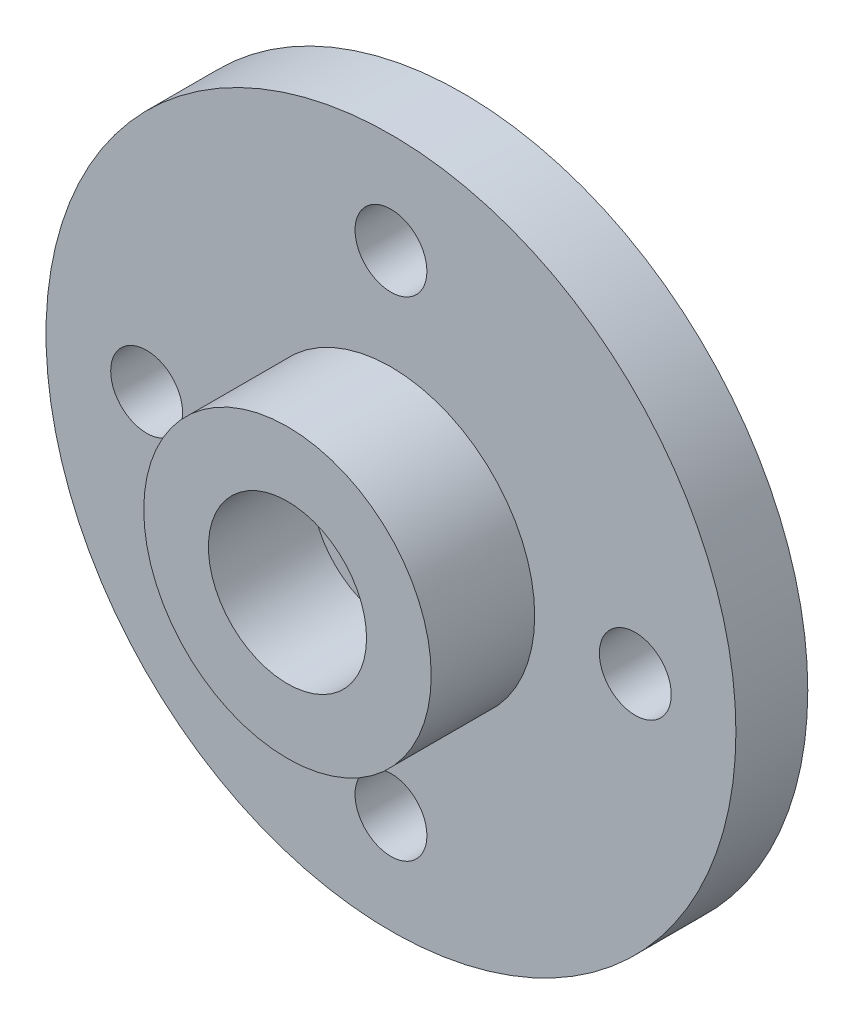
ISO-10303-21;
HEADER;
FILE_DESCRIPTION(('STEP AP214'),'2;1');
FILE_NAME('part.step','',(''),(''),'','','');
FILE_SCHEMA(('AUTOMOTIVE_DESIGN { 1 0 10303 214 1 1 1 1 }'));
ENDSEC;
DATA;
#1=APPLICATION_CONTEXT('core data for automotive mechanical design processes');
#2=APPLICATION_PROTOCOL_DEFINITION('international standard','automotive_design',2000,#1);
#3=PRODUCT_CONTEXT('',#1,'mechanical');
#4=PRODUCT('Part','Part','',(#3));
#5=PRODUCT_RELATED_PRODUCT_CATEGORY('part','',(#4));
#6=PRODUCT_DEFINITION_FORMATION('','',#4);
#7=PRODUCT_DEFINITION_CONTEXT('part definition',#1,'design');
#8=PRODUCT_DEFINITION('design','',#6,#7);
#9=PRODUCT_DEFINITION_SHAPE('','',#8);
#10=(LENGTH_UNIT() NAMED_UNIT(*) SI_UNIT(.MILLI.,.METRE.));
#11=(NAMED_UNIT(*) PLANE_ANGLE_UNIT() SI_UNIT($,.RADIAN.));
#12=(NAMED_UNIT(*) SI_UNIT($,.STERADIAN.) SOLID_ANGLE_UNIT());
#13=UNCERTAINTY_MEASURE_WITH_UNIT(LENGTH_MEASURE(1.E-05),#10,'distance_accuracy_value','');
#14=(GEOMETRIC_REPRESENTATION_CONTEXT(3) GLOBAL_UNCERTAINTY_ASSIGNED_CONTEXT((#13)) GLOBAL_UNIT_ASSIGNED_CONTEXT((#10,
#11,#12)) REPRESENTATION_CONTEXT('',''));
#15=CARTESIAN_POINT('',(0.,0.,0.));
#16=DIRECTION('',(0.,0.,1.));
#17=DIRECTION('',(1.,0.,0.));
#18=AXIS2_PLACEMENT_3D('',#15,#16,#17);
#19=CARTESIAN_POINT('',(0.,0.,2.5));
#20=DIRECTION('',(0.,0.,-1.));
#21=DIRECTION('',(-1.,0.,0.));
#22=AXIS2_PLACEMENT_3D('',#19,#20,#21);
#23=CYLINDRICAL_SURFACE('',#22,12.);
#24=CARTESIAN_POINT('',(0.,0.,2.5));
#25=DIRECTION('',(0.,0.,1.));
#26=DIRECTION('',(1.,0.,0.));
#27=AXIS2_PLACEMENT_3D('',#24,#25,#26);
#28=CIRCLE('',#27,12.);
#29=CARTESIAN_POINT('',(12.,0.,2.5));
#30=VERTEX_POINT('',#29);
#31=EDGE_CURVE('E37',#30,#30,#28,.T.);
#32=ORIENTED_EDGE('',*,*,#31,.F.);
#33=EDGE_LOOP('',(#32));
#34=FACE_BOUND('',#33,.T.);
#35=CARTESIAN_POINT('',(0.,0.,0.));
#36=DIRECTION('',(0.,0.,1.));
#37=DIRECTION('',(1.,0.,0.));
#38=AXIS2_PLACEMENT_3D('',#35,#36,#37);
#39=CIRCLE('',#38,12.);
#40=CARTESIAN_POINT('',(12.,0.,0.));
#41=VERTEX_POINT('',#40);
#42=EDGE_CURVE('E41',#41,#41,#39,.T.);
#43=ORIENTED_EDGE('',*,*,#42,.T.);
#44=EDGE_LOOP('',(#43));
#45=FACE_BOUND('',#44,.T.);
#46=ADVANCED_FACE('F30',(#34,#45),#23,.T.);
#47=CARTESIAN_POINT('',(0.,0.,2.5));
#48=DIRECTION('',(0.,0.,1.));
#49=DIRECTION('',(1.,0.,0.));
#50=AXIS2_PLACEMENT_3D('',#47,#48,#49);
#51=PLANE('',#50);
#52=CARTESIAN_POINT('',(0.,8.5,2.5));
#53=DIRECTION('',(0.,0.,1.));
#54=DIRECTION('',(1.,0.,0.));
#55=AXIS2_PLACEMENT_3D('',#52,#53,#54);
#56=CIRCLE('',#55,1.25);
#57=CARTESIAN_POINT('',(1.25,8.5,2.5));
#58=VERTEX_POINT('',#57);
#59=EDGE_CURVE('E55',#58,#58,#56,.T.);
#60=ORIENTED_EDGE('',*,*,#59,.F.);
#61=EDGE_LOOP('',(#60));
#62=FACE_BOUND('',#61,.T.);
#63=CARTESIAN_POINT('',(-8.50000000000024,2.40543580379159E-13,2.5));
#64=DIRECTION('',(0.,0.,1.));
#65=DIRECTION('',(1.,0.,0.));
#66=AXIS2_PLACEMENT_3D('',#63,#64,#65);
#67=CIRCLE('',#66,1.25000000000019);
#68=CARTESIAN_POINT('',(-7.25000000000005,2.40543580379159E-13,2.5));
#69=VERTEX_POINT('',#68);
#70=EDGE_CURVE('E58',#69,#69,#67,.T.);
#71=ORIENTED_EDGE('',*,*,#70,.F.);
#72=EDGE_LOOP('',(#71));
#73=FACE_BOUND('',#72,.T.);
#74=CARTESIAN_POINT('',(-4.81087160758318E-13,-8.5,2.5));
#75=DIRECTION('',(0.,0.,1.));
#76=DIRECTION('',(1.,0.,0.));
#77=AXIS2_PLACEMENT_3D('',#74,#75,#76);
#78=CIRCLE('',#77,1.25000000000052);
#79=CARTESIAN_POINT('',(1.25000000000004,-8.5,2.5));
#80=VERTEX_POINT('',#79);
#81=EDGE_CURVE('E61',#80,#80,#78,.T.);
#82=ORIENTED_EDGE('',*,*,#81,.F.);
#83=EDGE_LOOP('',(#82));
#84=FACE_BOUND('',#83,.T.);
#85=CARTESIAN_POINT('',(8.49999999999976,-2.41584530158434E-13,2.5));
#86=DIRECTION('',(0.,0.,1.));
#87=DIRECTION('',(1.,0.,0.));
#88=AXIS2_PLACEMENT_3D('',#85,#86,#87);
#89=CIRCLE('',#88,1.25000000000039);
#90=CARTESIAN_POINT('',(9.75000000000015,-2.41584530158434E-13,2.5));
#91=VERTEX_POINT('',#90);
#92=EDGE_CURVE('E64',#91,#91,#89,.T.);
#93=ORIENTED_EDGE('',*,*,#92,.F.);
#94=EDGE_LOOP('',(#93));
#95=FACE_BOUND('',#94,.T.);
#96=CARTESIAN_POINT('',(0.,0.,2.5));
#97=DIRECTION('',(0.,0.,1.));
#98=DIRECTION('',(1.,0.,0.));
#99=AXIS2_PLACEMENT_3D('',#96,#97,#98);
#100=CIRCLE('',#99,5.);
#101=CARTESIAN_POINT('',(5.,0.,2.5));
#102=VERTEX_POINT('',#101);
#103=EDGE_CURVE('E47',#102,#102,#100,.T.);
#104=ORIENTED_EDGE('',*,*,#103,.F.);
#105=EDGE_LOOP('',(#104));
#106=FACE_BOUND('',#105,.T.);
#107=ORIENTED_EDGE('',*,*,#31,.T.);
#108=EDGE_LOOP('',(#107));
#109=FACE_BOUND('',#108,.T.);
#110=ADVANCED_FACE('F89',(#62,#73,#84,#95,#106,#109),#51,.T.);
#111=CARTESIAN_POINT('',(0.,0.,0.));
#112=DIRECTION('',(0.,0.,1.));
#113=DIRECTION('',(1.,0.,0.));
#114=AXIS2_PLACEMENT_3D('',#111,#112,#113);
#115=PLANE('',#114);
#116=CARTESIAN_POINT('',(0.,8.5,0.));
#117=DIRECTION('',(0.,0.,-1.));
#118=DIRECTION('',(-1.,0.,0.));
#119=AXIS2_PLACEMENT_3D('',#116,#117,#118);
#120=CIRCLE('',#119,1.25);
#121=CARTESIAN_POINT('',(-1.25,8.5,0.));
#122=VERTEX_POINT('',#121);
#123=EDGE_CURVE('E70',#122,#122,#120,.T.);
#124=ORIENTED_EDGE('',*,*,#123,.F.);
#125=EDGE_LOOP('',(#124));
#126=FACE_BOUND('',#125,.T.);
#127=CARTESIAN_POINT('',(-8.50000000000024,2.40543580379159E-13,0.));
#128=DIRECTION('',(0.,0.,-1.));
#129=DIRECTION('',(-1.,0.,0.));
#130=AXIS2_PLACEMENT_3D('',#127,#128,#129);
#131=CIRCLE('',#130,1.25000000000019);
#132=CARTESIAN_POINT('',(-9.75000000000043,2.40543580379159E-13,0.));
#133=VERTEX_POINT('',#132);
#134=EDGE_CURVE('E71',#133,#133,#131,.T.);
#135=ORIENTED_EDGE('',*,*,#134,.F.);
#136=EDGE_LOOP('',(#135));
#137=FACE_BOUND('',#136,.T.);
#138=CARTESIAN_POINT('',(-4.81087160758318E-13,-8.5,0.));
#139=DIRECTION('',(0.,0.,-1.));
#140=DIRECTION('',(-1.,0.,0.));
#141=AXIS2_PLACEMENT_3D('',#138,#139,#140);
#142=CIRCLE('',#141,1.25000000000052);
#143=CARTESIAN_POINT('',(-1.250000000001,-8.5,0.));
#144=VERTEX_POINT('',#143);
#145=EDGE_CURVE('E74',#144,#144,#142,.T.);
#146=ORIENTED_EDGE('',*,*,#145,.F.);
#147=EDGE_LOOP('',(#146));
#148=FACE_BOUND('',#147,.T.);
#149=CARTESIAN_POINT('',(8.49999999999976,-2.41584530158434E-13,0.));
#150=DIRECTION('',(0.,0.,-1.));
#151=DIRECTION('',(-1.,0.,0.));
#152=AXIS2_PLACEMENT_3D('',#149,#150,#151);
#153=CIRCLE('',#152,1.25000000000039);
#154=CARTESIAN_POINT('',(7.24999999999938,-2.41584530158434E-13,0.));
#155=VERTEX_POINT('',#154);
#156=EDGE_CURVE('E77',#155,#155,#153,.T.);
#157=ORIENTED_EDGE('',*,*,#156,.F.);
#158=EDGE_LOOP('',(#157));
#159=FACE_BOUND('',#158,.T.);
#160=CARTESIAN_POINT('',(0.,0.,0.));
#161=DIRECTION('',(0.,0.,-1.));
#162=DIRECTION('',(-1.,0.,0.));
#163=AXIS2_PLACEMENT_3D('',#160,#161,#162);
#164=CIRCLE('',#163,1.49030594587746);
#165=CARTESIAN_POINT('',(-1.49030594587746,0.,0.));
#166=VERTEX_POINT('',#165);
#167=EDGE_CURVE('E67',#166,#166,#164,.T.);
#168=ORIENTED_EDGE('',*,*,#167,.F.);
#169=EDGE_LOOP('',(#168));
#170=FACE_BOUND('',#169,.T.);
#171=ORIENTED_EDGE('',*,*,#42,.F.);
#172=EDGE_LOOP('',(#171));
#173=FACE_BOUND('',#172,.T.);
#174=ADVANCED_FACE('F85',(#126,#137,#148,#159,#170,#173),#115,.F.);
#175=CARTESIAN_POINT('',(0.,0.,6.1));
#176=DIRECTION('',(0.,0.,1.));
#177=DIRECTION('',(1.,0.,0.));
#178=AXIS2_PLACEMENT_3D('',#175,#176,#177);
#179=PLANE('',#178);
#180=CARTESIAN_POINT('',(0.,0.,6.1));
#181=DIRECTION('',(0.,0.,1.));
#182=DIRECTION('',(1.,0.,0.));
#183=AXIS2_PLACEMENT_3D('',#180,#181,#182);
#184=CIRCLE('',#183,5.);
#185=CARTESIAN_POINT('',(5.,0.,6.1));
#186=VERTEX_POINT('',#185);
#187=EDGE_CURVE('E45',#186,#186,#184,.T.);
#188=ORIENTED_EDGE('',*,*,#187,.T.);
#189=EDGE_LOOP('',(#188));
#190=FACE_BOUND('',#189,.T.);
#191=CARTESIAN_POINT('',(0.,0.,6.1));
#192=DIRECTION('',(0.,0.,1.));
#193=DIRECTION('',(1.,0.,0.));
#194=AXIS2_PLACEMENT_3D('',#191,#192,#193);
#195=CIRCLE('',#194,2.75);
#196=CARTESIAN_POINT('',(2.75,0.,6.1));
#197=VERTEX_POINT('',#196);
#198=EDGE_CURVE('E50',#197,#197,#195,.T.);
#199=ORIENTED_EDGE('',*,*,#198,.F.);
#200=EDGE_LOOP('',(#199));
#201=FACE_BOUND('',#200,.T.);
#202=ADVANCED_FACE('F88',(#190,#201),#179,.T.);
#203=CARTESIAN_POINT('',(0.,0.,6.1));
#204=DIRECTION('',(0.,0.,-1.));
#205=DIRECTION('',(-1.,0.,0.));
#206=AXIS2_PLACEMENT_3D('',#203,#204,#205);
#207=CYLINDRICAL_SURFACE('',#206,5.);
#208=ORIENTED_EDGE('',*,*,#187,.F.);
#209=EDGE_LOOP('',(#208));
#210=FACE_BOUND('',#209,.T.);
#211=ORIENTED_EDGE('',*,*,#103,.T.);
#212=EDGE_LOOP('',(#211));
#213=FACE_BOUND('',#212,.T.);
#214=ADVANCED_FACE('F123',(#210,#213),#207,.T.);
#215=CARTESIAN_POINT('',(0.,0.,6.1));
#216=DIRECTION('',(0.,0.,-1.));
#217=DIRECTION('',(-1.,0.,0.));
#218=AXIS2_PLACEMENT_3D('',#215,#216,#217);
#219=CYLINDRICAL_SURFACE('',#218,2.75);
#220=ORIENTED_EDGE('',*,*,#198,.T.);
#221=EDGE_LOOP('',(#220));
#222=FACE_BOUND('',#221,.T.);
#223=CARTESIAN_POINT('',(0.,0.,2.5));
#224=DIRECTION('',(0.,0.,1.));
#225=DIRECTION('',(1.,0.,0.));
#226=AXIS2_PLACEMENT_3D('',#223,#224,#225);
#227=CIRCLE('',#226,2.75);
#228=CARTESIAN_POINT('',(2.75,0.,2.5));
#229=VERTEX_POINT('',#228);
#230=EDGE_CURVE('E10',#229,#229,#227,.F.);
#231=ORIENTED_EDGE('',*,*,#230,.T.);
#232=EDGE_LOOP('',(#231));
#233=FACE_BOUND('',#232,.T.);
#234=ADVANCED_FACE('F114',(#222,#233),#219,.F.);
#235=CARTESIAN_POINT('',(0.,0.,2.5));
#236=DIRECTION('',(0.,0.,1.));
#237=DIRECTION('',(1.,0.,0.));
#238=AXIS2_PLACEMENT_3D('',#235,#236,#237);
#239=CIRCLE('',#238,1.49030594587746);
#240=CARTESIAN_POINT('',(1.49030594587746,0.,2.5));
#241=VERTEX_POINT('',#240);
#242=EDGE_CURVE('E33',#241,#241,#239,.T.);
#243=ORIENTED_EDGE('',*,*,#242,.F.);
#244=EDGE_LOOP('',(#243));
#245=FACE_BOUND('',#244,.T.);
#246=ORIENTED_EDGE('',*,*,#230,.F.);
#247=EDGE_LOOP('',(#246));
#248=FACE_BOUND('',#247,.T.);
#249=ADVANCED_FACE('F104',(#245,#248),#51,.T.);
#250=CARTESIAN_POINT('',(0.,0.,6.1));
#251=DIRECTION('',(0.,0.,-1.));
#252=DIRECTION('',(-1.,0.,0.));
#253=AXIS2_PLACEMENT_3D('',#250,#251,#252);
#254=CYLINDRICAL_SURFACE('',#253,1.49030594587746);
#255=ORIENTED_EDGE('',*,*,#242,.T.);
#256=EDGE_LOOP('',(#255));
#257=FACE_BOUND('',#256,.T.);
#258=ORIENTED_EDGE('',*,*,#167,.T.);
#259=EDGE_LOOP('',(#258));
#260=FACE_BOUND('',#259,.T.);
#261=ADVANCED_FACE('F113',(#257,#260),#254,.F.);
#262=CARTESIAN_POINT('',(8.49999999999976,-2.41584530158434E-13,6.1));
#263=DIRECTION('',(0.,0.,-1.));
#264=DIRECTION('',(-1.,0.,0.));
#265=AXIS2_PLACEMENT_3D('',#262,#263,#264);
#266=CYLINDRICAL_SURFACE('',#265,1.25000000000039);
#267=ORIENTED_EDGE('',*,*,#92,.T.);
#268=EDGE_LOOP('',(#267));
#269=FACE_BOUND('',#268,.T.);
#270=ORIENTED_EDGE('',*,*,#156,.T.);
#271=EDGE_LOOP('',(#270));
#272=FACE_BOUND('',#271,.T.);
#273=ADVANCED_FACE('F120',(#269,#272),#266,.F.);
#274=CARTESIAN_POINT('',(-4.81087160758318E-13,-8.5,6.1));
#275=DIRECTION('',(0.,0.,-1.));
#276=DIRECTION('',(-1.,0.,0.));
#277=AXIS2_PLACEMENT_3D('',#274,#275,#276);
#278=CYLINDRICAL_SURFACE('',#277,1.25000000000052);
#279=ORIENTED_EDGE('',*,*,#81,.T.);
#280=EDGE_LOOP('',(#279));
#281=FACE_BOUND('',#280,.T.);
#282=ORIENTED_EDGE('',*,*,#145,.T.);
#283=EDGE_LOOP('',(#282));
#284=FACE_BOUND('',#283,.T.);
#285=ADVANCED_FACE('F83',(#281,#284),#278,.F.);
#286=CARTESIAN_POINT('',(-8.50000000000024,2.40543580379159E-13,6.1));
#287=DIRECTION('',(0.,0.,-1.));
#288=DIRECTION('',(-1.,0.,0.));
#289=AXIS2_PLACEMENT_3D('',#286,#287,#288);
#290=CYLINDRICAL_SURFACE('',#289,1.25000000000019);
#291=ORIENTED_EDGE('',*,*,#70,.T.);
#292=EDGE_LOOP('',(#291));
#293=FACE_BOUND('',#292,.T.);
#294=ORIENTED_EDGE('',*,*,#134,.T.);
#295=EDGE_LOOP('',(#294));
#296=FACE_BOUND('',#295,.T.);
#297=ADVANCED_FACE('F193',(#293,#296),#290,.F.);
#298=CARTESIAN_POINT('',(0.,8.5,6.1));
#299=DIRECTION('',(0.,0.,-1.));
#300=DIRECTION('',(-1.,0.,0.));
#301=AXIS2_PLACEMENT_3D('',#298,#299,#300);
#302=CYLINDRICAL_SURFACE('',#301,1.25);
#303=ORIENTED_EDGE('',*,*,#59,.T.);
#304=EDGE_LOOP('',(#303));
#305=FACE_BOUND('',#304,.T.);
#306=ORIENTED_EDGE('',*,*,#123,.T.);
#307=EDGE_LOOP('',(#306));
#308=FACE_BOUND('',#307,.T.);
#309=ADVANCED_FACE('F203',(#305,#308),#302,.F.);
#310=CLOSED_SHELL('',(#46,#110,#174,#202,#214,#234,#249,#261,#273,#285,#297,#309));
#311=MANIFOLD_SOLID_BREP('B2',#310);
#312=ADVANCED_BREP_SHAPE_REPRESENTATION('',(#18,#311),#14);
#313=SHAPE_DEFINITION_REPRESENTATION(#9,#312);
ENDSEC;
END-ISO-10303-21;
